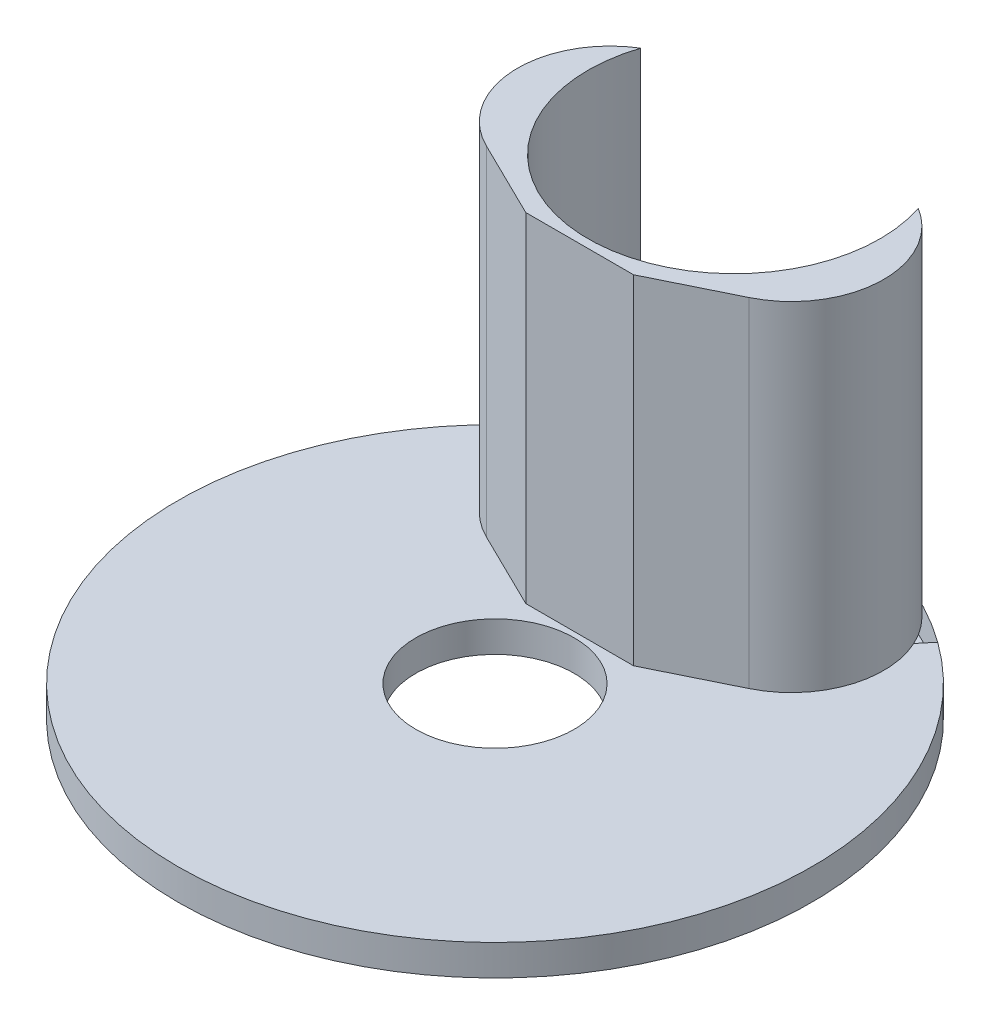
ISO-10303-21;
HEADER;
FILE_DESCRIPTION(('STEP AP214'),'2;1');
FILE_NAME('part.step','',(''),(''),'','','');
FILE_SCHEMA(('AUTOMOTIVE_DESIGN { 1 0 10303 214 1 1 1 1 }'));
ENDSEC;
DATA;
#1=APPLICATION_CONTEXT('core data for automotive mechanical design processes');
#2=APPLICATION_PROTOCOL_DEFINITION('international standard','automotive_design',2000,#1);
#3=PRODUCT_CONTEXT('',#1,'mechanical');
#4=PRODUCT('Part','Part','',(#3));
#5=PRODUCT_RELATED_PRODUCT_CATEGORY('part','',(#4));
#6=PRODUCT_DEFINITION_FORMATION('','',#4);
#7=PRODUCT_DEFINITION_CONTEXT('part definition',#1,'design');
#8=PRODUCT_DEFINITION('design','',#6,#7);
#9=PRODUCT_DEFINITION_SHAPE('','',#8);
#10=(LENGTH_UNIT() NAMED_UNIT(*) SI_UNIT(.MILLI.,.METRE.));
#11=(NAMED_UNIT(*) PLANE_ANGLE_UNIT() SI_UNIT($,.RADIAN.));
#12=(NAMED_UNIT(*) SI_UNIT($,.STERADIAN.) SOLID_ANGLE_UNIT());
#13=UNCERTAINTY_MEASURE_WITH_UNIT(LENGTH_MEASURE(1.E-05),#10,'distance_accuracy_value','');
#14=(GEOMETRIC_REPRESENTATION_CONTEXT(3) GLOBAL_UNCERTAINTY_ASSIGNED_CONTEXT((#13)) GLOBAL_UNIT_ASSIGNED_CONTEXT((#10,
#11,#12)) REPRESENTATION_CONTEXT('',''));
#15=CARTESIAN_POINT('',(0.,0.,0.));
#16=DIRECTION('',(0.,0.,1.));
#17=DIRECTION('',(1.,0.,0.));
#18=AXIS2_PLACEMENT_3D('',#15,#16,#17);
#19=CARTESIAN_POINT('',(0.,2.,0.));
#20=DIRECTION('',(0.,1.,0.));
#21=DIRECTION('',(0.,0.,1.));
#22=AXIS2_PLACEMENT_3D('',#19,#20,#21);
#23=PLANE('',#22);
#24=CARTESIAN_POINT('',(0.,2.,-13.));
#25=DIRECTION('',(0.,1.,0.));
#26=DIRECTION('',(0.,0.,1.));
#27=AXIS2_PLACEMENT_3D('',#24,#25,#26);
#28=CIRCLE('',#27,6.5);
#29=CARTESIAN_POINT('',(0.,2.,-6.5));
#30=VERTEX_POINT('',#29);
#31=EDGE_CURVE('E110',#30,#30,#28,.T.);
#32=ORIENTED_EDGE('',*,*,#31,.F.);
#33=EDGE_LOOP('',(#32));
#34=FACE_BOUND('',#33,.T.);
#35=CARTESIAN_POINT('',(0.,2.,-15.5296842366197));
#36=DIRECTION('',(0.,1.,0.));
#37=DIRECTION('',(0.,0.,1.));
#38=AXIS2_PLACEMENT_3D('',#35,#36,#37);
#39=CIRCLE('',#38,9.48692515810502);
#40=CARTESIAN_POINT('',(-9.01622934624997,2.,-18.4808462672962));
#41=VERTEX_POINT('',#40);
#42=CARTESIAN_POINT('',(9.01622934624997,2.,-18.4808462672962));
#43=VERTEX_POINT('',#42);
#44=EDGE_CURVE('E137',#41,#43,#39,.T.);
#45=ORIENTED_EDGE('',*,*,#44,.T.);
#46=CARTESIAN_POINT('',(5.89271105563149,2.,-13.3579922299288));
#47=DIRECTION('',(0.,1.,0.));
#48=DIRECTION('',(0.,0.,1.));
#49=AXIS2_PLACEMENT_3D('',#46,#47,#48);
#50=CIRCLE('',#49,6.);
#51=CARTESIAN_POINT('',(8.31437313328826,2.,-18.8475780778448));
#52=VERTEX_POINT('',#51);
#53=EDGE_CURVE('E195',#43,#52,#50,.T.);
#54=ORIENTED_EDGE('',*,*,#53,.T.);
#55=CARTESIAN_POINT('',(0.,2.,0.));
#56=DIRECTION('',(0.,1.,0.));
#57=DIRECTION('',(0.,0.,1.));
#58=AXIS2_PLACEMENT_3D('',#55,#56,#57);
#59=CIRCLE('',#58,20.6);
#60=CARTESIAN_POINT('',(-8.31437313328826,2.,-18.8475780778448));
#61=VERTEX_POINT('',#60);
#62=EDGE_CURVE('E163',#52,#61,#59,.T.);
#63=ORIENTED_EDGE('',*,*,#62,.T.);
#64=CARTESIAN_POINT('',(-5.89271105563149,2.,-13.3579922299288));
#65=DIRECTION('',(0.,1.,0.));
#66=DIRECTION('',(0.,0.,1.));
#67=AXIS2_PLACEMENT_3D('',#64,#65,#66);
#68=CIRCLE('',#67,6.);
#69=EDGE_CURVE('E191',#61,#41,#68,.T.);
#70=ORIENTED_EDGE('',*,*,#69,.T.);
#71=EDGE_LOOP('',(#45,#54,#63,#70));
#72=FACE_BOUND('',#71,.T.);
#73=ADVANCED_FACE('F41',(#34,#72),#23,.T.);
#74=CARTESIAN_POINT('',(0.,2.,0.));
#75=DIRECTION('',(0.,-1.,0.));
#76=DIRECTION('',(0.,0.,-1.));
#77=AXIS2_PLACEMENT_3D('',#74,#75,#76);
#78=CYLINDRICAL_SURFACE('',#77,20.6);
#79=EDGE_CURVE('E167',#61,#52,#59,.T.);
#80=ORIENTED_EDGE('',*,*,#79,.F.);
#81=ORIENTED_EDGE('',*,*,#62,.F.);
#82=EDGE_LOOP('',(#80,#81));
#83=FACE_BOUND('',#82,.T.);
#84=CARTESIAN_POINT('',(0.,0.,0.));
#85=DIRECTION('',(0.,1.,0.));
#86=DIRECTION('',(0.,0.,1.));
#87=AXIS2_PLACEMENT_3D('',#84,#85,#86);
#88=CIRCLE('',#87,20.6);
#89=CARTESIAN_POINT('',(0.,0.,20.6));
#90=VERTEX_POINT('',#89);
#91=EDGE_CURVE('E168',#90,#90,#88,.T.);
#92=ORIENTED_EDGE('',*,*,#91,.T.);
#93=EDGE_LOOP('',(#92));
#94=FACE_BOUND('',#93,.T.);
#95=ADVANCED_FACE('F216',(#83,#94),#78,.T.);
#96=DIRECTION('',(0.897709903987118,0.,-0.440587026912322));
#97=VECTOR('',#96,1.);
#98=CARTESIAN_POINT('',(-1.49594710795883,2.,-3.04803921274508));
#99=LINE('',#98,#97);
#100=CARTESIAN_POINT('',(3.5,2.,-5.5));
#101=VERTEX_POINT('',#100);
#102=CARTESIAN_POINT('',(8.53623321710542,2.,-7.97173280600611));
#103=VERTEX_POINT('',#102);
#104=EDGE_CURVE('E132',#101,#103,#99,.T.);
#105=ORIENTED_EDGE('',*,*,#104,.F.);
#106=DIRECTION('',(1.,0.,0.));
#107=VECTOR('',#106,1.);
#108=CARTESIAN_POINT('',(0.,2.,-5.5));
#109=LINE('',#108,#107);
#110=CARTESIAN_POINT('',(-3.5,2.,-5.5));
#111=VERTEX_POINT('',#110);
#112=EDGE_CURVE('E143',#111,#101,#109,.T.);
#113=ORIENTED_EDGE('',*,*,#112,.F.);
#114=DIRECTION('',(-0.897709903987118,0.,-0.440587026912322));
#115=VECTOR('',#114,1.);
#116=CARTESIAN_POINT('',(1.49594710795883,2.,-3.04803921274508));
#117=LINE('',#116,#115);
#118=CARTESIAN_POINT('',(-8.53623321710542,2.,-7.9717328060061));
#119=VERTEX_POINT('',#118);
#120=EDGE_CURVE('E106',#111,#119,#117,.T.);
#121=ORIENTED_EDGE('',*,*,#120,.T.);
#122=CARTESIAN_POINT('',(-5.89271105563149,2.,-13.3579922299288));
#123=DIRECTION('',(0.,1.,0.));
#124=DIRECTION('',(0.,0.,1.));
#125=AXIS2_PLACEMENT_3D('',#122,#123,#124);
#126=CIRCLE('',#125,6.);
#127=EDGE_CURVE('E11',#119,#41,#126,.F.);
#128=ORIENTED_EDGE('',*,*,#127,.T.);
#129=ORIENTED_EDGE('',*,*,#69,.F.);
#130=ORIENTED_EDGE('',*,*,#79,.T.);
#131=ORIENTED_EDGE('',*,*,#53,.F.);
#132=CARTESIAN_POINT('',(5.89271105563149,2.,-13.3579922299288));
#133=DIRECTION('',(0.,1.,0.));
#134=DIRECTION('',(0.,0.,1.));
#135=AXIS2_PLACEMENT_3D('',#132,#133,#134);
#136=CIRCLE('',#135,6.);
#137=EDGE_CURVE('E50',#43,#103,#136,.F.);
#138=ORIENTED_EDGE('',*,*,#137,.T.);
#139=EDGE_LOOP('',(#105,#113,#121,#128,#129,#130,#131,#138));
#140=FACE_BOUND('',#139,.T.);
#141=CARTESIAN_POINT('',(0.,2.,0.));
#142=DIRECTION('',(0.,1.,0.));
#143=DIRECTION('',(0.,0.,1.));
#144=AXIS2_PLACEMENT_3D('',#141,#142,#143);
#145=CIRCLE('',#144,5.15);
#146=CARTESIAN_POINT('',(0.,2.,5.15));
#147=VERTEX_POINT('',#146);
#148=EDGE_CURVE('E155',#147,#147,#145,.T.);
#149=ORIENTED_EDGE('',*,*,#148,.F.);
#150=EDGE_LOOP('',(#149));
#151=FACE_BOUND('',#150,.T.);
#152=ADVANCED_FACE('F204',(#140,#151),#23,.T.);
#153=CARTESIAN_POINT('',(0.,0.,0.));
#154=DIRECTION('',(0.,1.,0.));
#155=DIRECTION('',(0.,0.,1.));
#156=AXIS2_PLACEMENT_3D('',#153,#154,#155);
#157=PLANE('',#156);
#158=CARTESIAN_POINT('',(0.,0.,-13.));
#159=DIRECTION('',(0.,1.,0.));
#160=DIRECTION('',(0.,0.,1.));
#161=AXIS2_PLACEMENT_3D('',#158,#159,#160);
#162=CIRCLE('',#161,6.5);
#163=CARTESIAN_POINT('',(0.,0.,-6.5));
#164=VERTEX_POINT('',#163);
#165=EDGE_CURVE('E151',#164,#164,#162,.T.);
#166=ORIENTED_EDGE('',*,*,#165,.T.);
#167=EDGE_LOOP('',(#166));
#168=FACE_BOUND('',#167,.T.);
#169=CARTESIAN_POINT('',(0.,0.,0.));
#170=DIRECTION('',(0.,1.,0.));
#171=DIRECTION('',(0.,0.,1.));
#172=AXIS2_PLACEMENT_3D('',#169,#170,#171);
#173=CIRCLE('',#172,5.15);
#174=CARTESIAN_POINT('',(0.,0.,5.15));
#175=VERTEX_POINT('',#174);
#176=EDGE_CURVE('E162',#175,#175,#173,.T.);
#177=ORIENTED_EDGE('',*,*,#176,.T.);
#178=EDGE_LOOP('',(#177));
#179=FACE_BOUND('',#178,.T.);
#180=ORIENTED_EDGE('',*,*,#91,.F.);
#181=EDGE_LOOP('',(#180));
#182=FACE_BOUND('',#181,.T.);
#183=ADVANCED_FACE('F223',(#168,#179,#182),#157,.F.);
#184=CARTESIAN_POINT('',(0.,-1.,0.));
#185=DIRECTION('',(0.,1.,0.));
#186=DIRECTION('',(0.,0.,1.));
#187=AXIS2_PLACEMENT_3D('',#184,#185,#186);
#188=CYLINDRICAL_SURFACE('',#187,5.15);
#189=ORIENTED_EDGE('',*,*,#148,.T.);
#190=EDGE_LOOP('',(#189));
#191=FACE_BOUND('',#190,.T.);
#192=ORIENTED_EDGE('',*,*,#176,.F.);
#193=EDGE_LOOP('',(#192));
#194=FACE_BOUND('',#193,.T.);
#195=ADVANCED_FACE('F225',(#191,#194),#188,.F.);
#196=CARTESIAN_POINT('',(0.,0.,-13.));
#197=DIRECTION('',(0.,1.,0.));
#198=DIRECTION('',(0.,0.,1.));
#199=AXIS2_PLACEMENT_3D('',#196,#197,#198);
#200=CYLINDRICAL_SURFACE('',#199,6.5);
#201=ORIENTED_EDGE('',*,*,#165,.F.);
#202=EDGE_LOOP('',(#201));
#203=FACE_BOUND('',#202,.T.);
#204=ORIENTED_EDGE('',*,*,#31,.T.);
#205=EDGE_LOOP('',(#204));
#206=FACE_BOUND('',#205,.T.);
#207=ADVANCED_FACE('F232',(#203,#206),#200,.F.);
#208=CARTESIAN_POINT('',(0.,24.,-15.5296842366197));
#209=DIRECTION('',(0.,-1.,0.));
#210=DIRECTION('',(0.,0.,-1.));
#211=AXIS2_PLACEMENT_3D('',#208,#209,#210);
#212=CYLINDRICAL_SURFACE('',#211,9.48692515810502);
#213=CARTESIAN_POINT('',(0.,24.,-15.5296842366197));
#214=DIRECTION('',(0.,1.,0.));
#215=DIRECTION('',(0.,0.,1.));
#216=AXIS2_PLACEMENT_3D('',#213,#214,#215);
#217=CIRCLE('',#216,9.48692515810502);
#218=CARTESIAN_POINT('',(-9.01622934624997,24.,-18.4808462672962));
#219=VERTEX_POINT('',#218);
#220=CARTESIAN_POINT('',(9.01622934624997,24.,-18.4808462672962));
#221=VERTEX_POINT('',#220);
#222=EDGE_CURVE('E128',#219,#221,#217,.T.);
#223=ORIENTED_EDGE('',*,*,#222,.T.);
#224=DIRECTION('',(0.,-1.,0.));
#225=VECTOR('',#224,1.);
#226=CARTESIAN_POINT('',(9.01622934624997,24.,-18.4808462672962));
#227=LINE('',#226,#225);
#228=EDGE_CURVE('E187',#221,#43,#227,.T.);
#229=ORIENTED_EDGE('',*,*,#228,.T.);
#230=ORIENTED_EDGE('',*,*,#44,.F.);
#231=DIRECTION('',(0.,-1.,0.));
#232=VECTOR('',#231,1.);
#233=CARTESIAN_POINT('',(-9.01622934624997,2.,-18.4808462672962));
#234=LINE('',#233,#232);
#235=EDGE_CURVE('E184',#41,#219,#234,.F.);
#236=ORIENTED_EDGE('',*,*,#235,.T.);
#237=EDGE_LOOP('',(#223,#229,#230,#236));
#238=FACE_BOUND('',#237,.T.);
#239=ADVANCED_FACE('F210',(#238),#212,.F.);
#240=CARTESIAN_POINT('',(1.49594710795883,24.,-3.04803921274508));
#241=DIRECTION('',(-0.440587026912321,0.,0.897709903987118));
#242=DIRECTION('',(0.897709903987118,0.,0.440587026912321));
#243=AXIS2_PLACEMENT_3D('',#240,#241,#242);
#244=PLANE('',#243);
#245=DIRECTION('',(-0.897709903987118,0.,-0.440587026912322));
#246=VECTOR('',#245,1.);
#247=CARTESIAN_POINT('',(1.49594710795883,24.,-3.04803921274508));
#248=LINE('',#247,#246);
#249=CARTESIAN_POINT('',(-3.5,24.,-5.5));
#250=VERTEX_POINT('',#249);
#251=CARTESIAN_POINT('',(-8.53623321710542,24.,-7.9717328060061));
#252=VERTEX_POINT('',#251);
#253=EDGE_CURVE('E104',#250,#252,#248,.T.);
#254=ORIENTED_EDGE('',*,*,#253,.T.);
#255=DIRECTION('',(0.,1.,0.));
#256=VECTOR('',#255,1.);
#257=CARTESIAN_POINT('',(-8.53623321710542,2.,-7.9717328060061));
#258=LINE('',#257,#256);
#259=EDGE_CURVE('E199',#252,#119,#258,.F.);
#260=ORIENTED_EDGE('',*,*,#259,.T.);
#261=ORIENTED_EDGE('',*,*,#120,.F.);
#262=DIRECTION('',(0.,-1.,0.));
#263=VECTOR('',#262,1.);
#264=CARTESIAN_POINT('',(-3.5,24.,-5.5));
#265=LINE('',#264,#263);
#266=EDGE_CURVE('E100',#250,#111,#265,.T.);
#267=ORIENTED_EDGE('',*,*,#266,.F.);
#268=EDGE_LOOP('',(#254,#260,#261,#267));
#269=FACE_BOUND('',#268,.T.);
#270=ADVANCED_FACE('F102',(#269),#244,.T.);
#271=CARTESIAN_POINT('',(0.,24.,-5.5));
#272=DIRECTION('',(0.,0.,-1.));
#273=DIRECTION('',(-1.,0.,0.));
#274=AXIS2_PLACEMENT_3D('',#271,#272,#273);
#275=PLANE('',#274);
#276=ORIENTED_EDGE('',*,*,#112,.T.);
#277=DIRECTION('',(0.,-1.,0.));
#278=VECTOR('',#277,1.);
#279=CARTESIAN_POINT('',(3.5,24.,-5.5));
#280=LINE('',#279,#278);
#281=CARTESIAN_POINT('',(3.5,24.,-5.5));
#282=VERTEX_POINT('',#281);
#283=EDGE_CURVE('E111',#282,#101,#280,.T.);
#284=ORIENTED_EDGE('',*,*,#283,.F.);
#285=DIRECTION('',(1.,0.,0.));
#286=VECTOR('',#285,1.);
#287=CARTESIAN_POINT('',(0.,24.,-5.5));
#288=LINE('',#287,#286);
#289=EDGE_CURVE('E114',#250,#282,#288,.T.);
#290=ORIENTED_EDGE('',*,*,#289,.F.);
#291=ORIENTED_EDGE('',*,*,#266,.T.);
#292=EDGE_LOOP('',(#276,#284,#290,#291));
#293=FACE_BOUND('',#292,.T.);
#294=ADVANCED_FACE('F115',(#293),#275,.F.);
#295=CARTESIAN_POINT('',(-1.49594710795883,24.,-3.04803921274508));
#296=DIRECTION('',(-0.440587026912321,0.,-0.897709903987118));
#297=DIRECTION('',(-0.897709903987118,0.,0.440587026912321));
#298=AXIS2_PLACEMENT_3D('',#295,#296,#297);
#299=PLANE('',#298);
#300=ORIENTED_EDGE('',*,*,#104,.T.);
#301=DIRECTION('',(0.,-1.,0.));
#302=VECTOR('',#301,1.);
#303=CARTESIAN_POINT('',(8.53623321710542,24.,-7.97173280600611));
#304=LINE('',#303,#302);
#305=CARTESIAN_POINT('',(8.53623321710542,24.,-7.97173280600611));
#306=VERTEX_POINT('',#305);
#307=EDGE_CURVE('E175',#103,#306,#304,.F.);
#308=ORIENTED_EDGE('',*,*,#307,.T.);
#309=DIRECTION('',(0.897709903987118,0.,-0.440587026912322));
#310=VECTOR('',#309,1.);
#311=CARTESIAN_POINT('',(-1.49594710795883,24.,-3.04803921274508));
#312=LINE('',#311,#310);
#313=EDGE_CURVE('E121',#282,#306,#312,.T.);
#314=ORIENTED_EDGE('',*,*,#313,.F.);
#315=ORIENTED_EDGE('',*,*,#283,.T.);
#316=EDGE_LOOP('',(#300,#308,#314,#315));
#317=FACE_BOUND('',#316,.T.);
#318=ADVANCED_FACE('F207',(#317),#299,.F.);
#319=CARTESIAN_POINT('',(0.,24.,0.));
#320=DIRECTION('',(0.,1.,0.));
#321=DIRECTION('',(0.,0.,1.));
#322=AXIS2_PLACEMENT_3D('',#319,#320,#321);
#323=PLANE('',#322);
#324=ORIENTED_EDGE('',*,*,#313,.T.);
#325=CARTESIAN_POINT('',(5.89271105563149,24.,-13.3579922299288));
#326=DIRECTION('',(0.,1.,0.));
#327=DIRECTION('',(0.,0.,1.));
#328=AXIS2_PLACEMENT_3D('',#325,#326,#327);
#329=CIRCLE('',#328,6.);
#330=EDGE_CURVE('E181',#306,#221,#329,.T.);
#331=ORIENTED_EDGE('',*,*,#330,.T.);
#332=ORIENTED_EDGE('',*,*,#222,.F.);
#333=CARTESIAN_POINT('',(-5.89271105563149,24.,-13.3579922299288));
#334=DIRECTION('',(0.,1.,0.));
#335=DIRECTION('',(0.,0.,1.));
#336=AXIS2_PLACEMENT_3D('',#333,#334,#335);
#337=CIRCLE('',#336,6.);
#338=EDGE_CURVE('E126',#219,#252,#337,.T.);
#339=ORIENTED_EDGE('',*,*,#338,.T.);
#340=ORIENTED_EDGE('',*,*,#253,.F.);
#341=ORIENTED_EDGE('',*,*,#289,.T.);
#342=EDGE_LOOP('',(#324,#331,#332,#339,#340,#341));
#343=FACE_BOUND('',#342,.T.);
#344=ADVANCED_FACE('F123',(#343),#323,.T.);
#345=CARTESIAN_POINT('',(5.89271105563149,2.,-13.3579922299288));
#346=DIRECTION('',(0.,-1.,0.));
#347=DIRECTION('',(0.,0.,-1.));
#348=AXIS2_PLACEMENT_3D('',#345,#346,#347);
#349=CYLINDRICAL_SURFACE('',#348,6.);
#350=ORIENTED_EDGE('',*,*,#330,.F.);
#351=ORIENTED_EDGE('',*,*,#307,.F.);
#352=ORIENTED_EDGE('',*,*,#137,.F.);
#353=ORIENTED_EDGE('',*,*,#228,.F.);
#354=EDGE_LOOP('',(#350,#351,#352,#353));
#355=FACE_BOUND('',#354,.T.);
#356=ADVANCED_FACE('F208',(#355),#349,.T.);
#357=CARTESIAN_POINT('',(-5.89271105563149,2.,-13.3579922299288));
#358=DIRECTION('',(0.,-1.,0.));
#359=DIRECTION('',(0.,0.,-1.));
#360=AXIS2_PLACEMENT_3D('',#357,#358,#359);
#361=CYLINDRICAL_SURFACE('',#360,6.);
#362=ORIENTED_EDGE('',*,*,#235,.F.);
#363=ORIENTED_EDGE('',*,*,#127,.F.);
#364=ORIENTED_EDGE('',*,*,#259,.F.);
#365=ORIENTED_EDGE('',*,*,#338,.F.);
#366=EDGE_LOOP('',(#362,#363,#364,#365));
#367=FACE_BOUND('',#366,.T.);
#368=ADVANCED_FACE('F43',(#367),#361,.T.);
#369=CLOSED_SHELL('',(#73,#95,#152,#183,#195,#207,#239,#270,#294,#318,#344,#356,#368));
#370=MANIFOLD_SOLID_BREP('B2',#369);
#371=ADVANCED_BREP_SHAPE_REPRESENTATION('',(#18,#370),#14);
#372=SHAPE_DEFINITION_REPRESENTATION(#9,#371);
ENDSEC;
END-ISO-10303-21;
